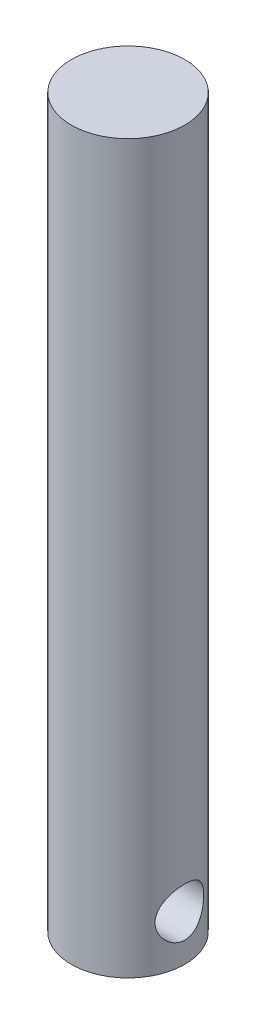
ISO-10303-21;
HEADER;
FILE_DESCRIPTION(('STEP AP214'),'2;1');
FILE_NAME('part.step','',(''),(''),'','','');
FILE_SCHEMA(('AUTOMOTIVE_DESIGN { 1 0 10303 214 1 1 1 1 }'));
ENDSEC;
DATA;
#1=APPLICATION_CONTEXT('core data for automotive mechanical design processes');
#2=APPLICATION_PROTOCOL_DEFINITION('international standard','automotive_design',2000,#1);
#3=PRODUCT_CONTEXT('',#1,'mechanical');
#4=PRODUCT('Part','Part','',(#3));
#5=PRODUCT_RELATED_PRODUCT_CATEGORY('part','',(#4));
#6=PRODUCT_DEFINITION_FORMATION('','',#4);
#7=PRODUCT_DEFINITION_CONTEXT('part definition',#1,'design');
#8=PRODUCT_DEFINITION('design','',#6,#7);
#9=PRODUCT_DEFINITION_SHAPE('','',#8);
#10=(LENGTH_UNIT() NAMED_UNIT(*) SI_UNIT(.MILLI.,.METRE.));
#11=(NAMED_UNIT(*) PLANE_ANGLE_UNIT() SI_UNIT($,.RADIAN.));
#12=(NAMED_UNIT(*) SI_UNIT($,.STERADIAN.) SOLID_ANGLE_UNIT());
#13=UNCERTAINTY_MEASURE_WITH_UNIT(LENGTH_MEASURE(1.E-05),#10,'distance_accuracy_value','');
#14=(GEOMETRIC_REPRESENTATION_CONTEXT(3) GLOBAL_UNCERTAINTY_ASSIGNED_CONTEXT((#13)) GLOBAL_UNIT_ASSIGNED_CONTEXT((#10,
#11,#12)) REPRESENTATION_CONTEXT('',''));
#15=CARTESIAN_POINT('',(0.,0.,0.));
#16=DIRECTION('',(0.,0.,1.));
#17=DIRECTION('',(1.,0.,0.));
#18=AXIS2_PLACEMENT_3D('',#15,#16,#17);
#19=CARTESIAN_POINT('',(0.,50.8,0.));
#20=DIRECTION('',(0.,-1.,0.));
#21=DIRECTION('',(0.,0.,1.));
#22=AXIS2_PLACEMENT_3D('',#19,#20,#21);
#23=CYLINDRICAL_SURFACE('',#22,3.96875);
#24=CARTESIAN_POINT('',(-3.58622037282987,3.175,1.7));
#25=CARTESIAN_POINT('',(-3.58623113706892,3.08459005344208,1.69998911546172));
#26=CARTESIAN_POINT('',(-3.58968938900767,2.99404356277239,1.69274199167995));
#27=CARTESIAN_POINT('',(-3.60307871804978,2.81557963908529,1.6640411575309));
#28=CARTESIAN_POINT('',(-3.61302690266575,2.72766979872845,1.64254989711271));
#29=CARTESIAN_POINT('',(-3.63804219046086,2.55739037711525,1.58636684632454));
#30=CARTESIAN_POINT('',(-3.65308759133628,2.47499905225026,1.55173094765683));
#31=CARTESIAN_POINT('',(-3.68657122753554,2.3172187711832,1.4704064892417));
#32=CARTESIAN_POINT('',(-3.70500879408357,2.24182843911496,1.42372030451515));
#33=CARTESIAN_POINT('',(-3.74455582562221,2.09518271102688,1.31633507475202));
#34=CARTESIAN_POINT('',(-3.76575910737061,2.02444335997849,1.25496554021632));
#35=CARTESIAN_POINT('',(-3.8076796275402,1.8938765569399,1.12136187333479));
#36=CARTESIAN_POINT('',(-3.8283966693971,1.83405345386459,1.04912343175391));
#37=CARTESIAN_POINT('',(-3.86816191973165,1.72433167004081,0.891728093718384));
#38=CARTESIAN_POINT('',(-3.88708845202858,1.67502072481835,0.80612793261505));
#39=CARTESIAN_POINT('',(-3.91998324015899,1.5917241528577,0.626889116143654));
#40=CARTESIAN_POINT('',(-3.93395381514694,1.55773135592966,0.53325424618402));
#41=CARTESIAN_POINT('',(-3.95469596900494,1.5079284067925,0.346028881740543));
#42=CARTESIAN_POINT('',(-3.96181911296762,1.49122644157612,0.252715371302695));
#43=CARTESIAN_POINT('',(-3.96934545838333,1.47359037231403,0.064356867094234));
#44=CARTESIAN_POINT('',(-3.96975155028843,1.47264948602845,-0.0306873642928482));
#45=CARTESIAN_POINT('',(-3.96399993382167,1.48611070884914,-0.213297108302966));
#46=CARTESIAN_POINT('',(-3.95826228294521,1.49953089186249,-0.300950773026008));
#47=CARTESIAN_POINT('',(-3.94145238730588,1.53964056824275,-0.472621705663843));
#48=CARTESIAN_POINT('',(-3.93037974833308,1.56633104217516,-0.556638704360109));
#49=CARTESIAN_POINT('',(-3.90374947102569,1.63253035483458,-0.720204048389507));
#50=CARTESIAN_POINT('',(-3.88812579368853,1.67222909698207,-0.799664337948033));
#51=CARTESIAN_POINT('',(-3.85390657578562,1.76312530568893,-0.951004404799201));
#52=CARTESIAN_POINT('',(-3.83530996854243,1.8143269021171,-1.02288144582381));
#53=CARTESIAN_POINT('',(-3.79537378132377,1.93116868168375,-1.16266167991575));
#54=CARTESIAN_POINT('',(-3.77393305560751,1.99759621203648,-1.22987875853107));
#55=CARTESIAN_POINT('',(-3.73173757559351,2.14080134495101,-1.35252605827245));
#56=CARTESIAN_POINT('',(-3.71098312002685,2.21758338282395,-1.40795120200164));
#57=CARTESIAN_POINT('',(-3.67176355740824,2.38283109399904,-1.50734671475435));
#58=CARTESIAN_POINT('',(-3.65340926120111,2.47162028600367,-1.55082677647832));
#59=CARTESIAN_POINT('',(-3.62240664524944,2.65625415543747,-1.62193371634608));
#60=CARTESIAN_POINT('',(-3.60975397811487,2.75209339224905,-1.64957267743231));
#61=CARTESIAN_POINT('',(-3.59268323727969,2.94121847824614,-1.68641381079726));
#62=CARTESIAN_POINT('',(-3.58776749724183,3.03424084026704,-1.69673336462996));
#63=CARTESIAN_POINT('',(-3.58530184937887,3.2207980552888,-1.70194025822124));
#64=CARTESIAN_POINT('',(-3.5877491419163,3.31433270000521,-1.69683346351972));
#65=CARTESIAN_POINT('',(-3.59921731420729,3.49241412668582,-1.67235374478536));
#66=CARTESIAN_POINT('',(-3.60777054658429,3.57713436986088,-1.653994735474));
#67=CARTESIAN_POINT('',(-3.62987674405693,3.74221182744115,-1.60489586590083));
#68=CARTESIAN_POINT('',(-3.64343092274405,3.82256797736696,-1.57415300025295));
#69=CARTESIAN_POINT('',(-3.6747268969317,3.98054569750963,-1.49968412721792));
#70=CARTESIAN_POINT('',(-3.69262508180863,4.05789666043565,-1.45545195142779));
#71=CARTESIAN_POINT('',(-3.73038151502514,4.20446332016495,-1.35575407279594));
#72=CARTESIAN_POINT('',(-3.7502406424614,4.27367533751209,-1.30028331983657));
#73=CARTESIAN_POINT('',(-3.79176455129882,4.40826919257133,-1.17400308940507));
#74=CARTESIAN_POINT('',(-3.81343616572478,4.47279446689132,-1.1022791902822));
#75=CARTESIAN_POINT('',(-3.85455404679553,4.58906239695361,-0.948533416909004));
#76=CARTESIAN_POINT('',(-3.87400009165408,4.64080377932815,-0.866510518030355));
#77=CARTESIAN_POINT('',(-3.90865457956745,4.73009137953567,-0.693679406401621));
#78=CARTESIAN_POINT('',(-3.92384194401562,4.7675673052295,-0.60283039006871));
#79=CARTESIAN_POINT('',(-3.94809086795851,4.82641480522334,-0.415295380859746));
#80=CARTESIAN_POINT('',(-3.95715630336448,4.84779657003157,-0.318613123443799));
#81=CARTESIAN_POINT('',(-3.96767127075444,4.8725130831658,-0.129788880179495));
#82=CARTESIAN_POINT('',(-3.96962935609121,4.87705346004854,-0.0378320493048763));
#83=CARTESIAN_POINT('',(-3.96714023501053,4.87124100800158,0.145510784931608));
#84=CARTESIAN_POINT('',(-3.96269426781214,4.86089106043125,0.236896895294529));
#85=CARTESIAN_POINT('',(-3.94817145617615,4.82645685339129,0.412811561785949));
#86=CARTESIAN_POINT('',(-3.93832136204818,4.80292490796238,0.497468546509107));
#87=CARTESIAN_POINT('',(-3.9140982764196,4.74341486237072,0.661587998364473));
#88=CARTESIAN_POINT('',(-3.8997244519767,4.70743446998762,0.741049505610523));
#89=CARTESIAN_POINT('',(-3.8670169985917,4.62222481149873,0.89652381189233));
#90=CARTESIAN_POINT('',(-3.84853264024002,4.57246602223183,0.97221391607124));
#91=CARTESIAN_POINT('',(-3.80976603642735,4.46186487546169,1.11449824350403));
#92=CARTESIAN_POINT('',(-3.78948308203129,4.4010181374709,1.18108885358492));
#93=CARTESIAN_POINT('',(-3.74754436850339,4.26477474597478,1.30831783828415));
#94=CARTESIAN_POINT('',(-3.72589576200376,4.18864279864083,1.368173975489));
#95=CARTESIAN_POINT('',(-3.68515605259579,4.02677477679791,1.47439832182803));
#96=CARTESIAN_POINT('',(-3.66606644026516,3.94103315771583,1.52075868812735));
#97=CARTESIAN_POINT('',(-3.63291840219493,3.76221239686101,1.59833196339931));
#98=CARTESIAN_POINT('',(-3.61885058446783,3.66914735395346,1.62957318823252));
#99=CARTESIAN_POINT('',(-3.59780126037644,3.47844788022475,1.67555044144813));
#100=CARTESIAN_POINT('',(-3.59079599179021,3.38082993573814,1.69034183337361));
#101=CARTESIAN_POINT('',(-3.58675667806582,3.24686351662433,1.69886499090494));
#102=CARTESIAN_POINT('',(-3.58621609349779,3.21094254848225,1.70000432715713));
#103=CARTESIAN_POINT('',(-3.58622037282987,3.175,1.7));
#104=B_SPLINE_CURVE_WITH_KNOTS('',3,(#24,#25,#26,#27,#28,#29,#30,#31,#32,#33,#34,#35,#36,#37,
#38,#39,#40,#41,#42,#43,#44,#45,#46,#47,#48,#49,#50,#51,#52,#53,#54,#55,#56,#57,#58,#59,#60,#61,
#62,#63,#64,#65,#66,#67,#68,#69,#70,#71,#72,#73,#74,#75,#76,#77,#78,#79,#80,#81,#82,#83,#84,#85,
#86,#87,#88,#89,#90,#91,#92,#93,#94,#95,#96,#97,#98,#99,#100,#101,#102,#103),.UNSPECIFIED.,.T.,
.F.,(4,2,2,2,2,2,2,2,2,2,2,2,2,2,2,2,2,2,2,2,2,2,2,2,2,2,2,2,2,2,2,2,2,2,2,2,2,2,2,4),(0.,
0.271122267186831,0.542962118356002,0.813658812563502,1.08430219517141,1.37111310872573,
1.65803803635866,1.95824745055016,2.25831619498843,2.5419933352771,2.82554840169842,
3.09088463268955,3.35624047276307,3.62565692960539,3.89517027003921,4.18459901178047,
4.474152125282,4.77424342805826,5.07410552781407,5.35375082399783,5.63328980440983,
5.89344279537735,6.15365895985511,6.42518379870137,6.69683092044961,6.99210230451842,
7.2874030878983,7.58414067105511,7.88069020735217,8.15554910363005,8.43035482035872,
8.69442547174946,8.95854477423391,9.23471297067145,9.51099050964756,9.80731026576914,
10.103801880814,10.3997360421804,10.6946711649093,10.8024560448255),.UNSPECIFIED.);
#105=CARTESIAN_POINT('',(-3.58622037282987,3.175,1.7));
#106=VERTEX_POINT('',#105);
#107=EDGE_CURVE('E48',#106,#106,#104,.T.);
#108=ORIENTED_EDGE('',*,*,#107,.T.);
#109=EDGE_LOOP('',(#108));
#110=FACE_BOUND('',#109,.T.);
#111=CARTESIAN_POINT('',(3.58622037282987,3.175,1.7));
#112=CARTESIAN_POINT('',(3.58623113706892,3.26540994655792,1.69998911546172));
#113=CARTESIAN_POINT('',(3.58968938900767,3.35595643722761,1.69274199167995));
#114=CARTESIAN_POINT('',(3.60307871804978,3.53442036091471,1.6640411575309));
#115=CARTESIAN_POINT('',(3.61302690266575,3.62233020127155,1.64254989711271));
#116=CARTESIAN_POINT('',(3.63804219046086,3.79260962288475,1.58636684632454));
#117=CARTESIAN_POINT('',(3.65308759133628,3.87500094774974,1.55173094765683));
#118=CARTESIAN_POINT('',(3.68657122753554,4.0327812288168,1.4704064892417));
#119=CARTESIAN_POINT('',(3.70500879408357,4.10817156088504,1.42372030451515));
#120=CARTESIAN_POINT('',(3.74455582562221,4.25481728897312,1.31633507475202));
#121=CARTESIAN_POINT('',(3.76575910737061,4.32555664002151,1.25496554021632));
#122=CARTESIAN_POINT('',(3.8076796275402,4.4561234430601,1.12136187333479));
#123=CARTESIAN_POINT('',(3.8283966693971,4.51594654613541,1.04912343175391));
#124=CARTESIAN_POINT('',(3.86816191973165,4.62566832995919,0.891728093718384));
#125=CARTESIAN_POINT('',(3.88708845202858,4.67497927518165,0.80612793261505));
#126=CARTESIAN_POINT('',(3.91998324015899,4.7582758471423,0.626889116143653));
#127=CARTESIAN_POINT('',(3.93395381514694,4.79226864407034,0.533254246184019));
#128=CARTESIAN_POINT('',(3.95469596900494,4.8420715932075,0.346028881740543));
#129=CARTESIAN_POINT('',(3.96181911296762,4.85877355842388,0.252715371302695));
#130=CARTESIAN_POINT('',(3.96934545838333,4.87640962768597,0.0643568670942337));
#131=CARTESIAN_POINT('',(3.96975155028843,4.87735051397155,-0.0306873642928486));
#132=CARTESIAN_POINT('',(3.96399993382167,4.86388929115086,-0.213297108302967));
#133=CARTESIAN_POINT('',(3.95826228294521,4.85046910813751,-0.300950773026008));
#134=CARTESIAN_POINT('',(3.94145238730588,4.81035943175725,-0.472621705663843));
#135=CARTESIAN_POINT('',(3.93037974833308,4.78366895782484,-0.556638704360109));
#136=CARTESIAN_POINT('',(3.90374947102569,4.71746964516542,-0.720204048389507));
#137=CARTESIAN_POINT('',(3.88812579368853,4.67777090301793,-0.799664337948034));
#138=CARTESIAN_POINT('',(3.85390657578562,4.58687469431107,-0.951004404799202));
#139=CARTESIAN_POINT('',(3.83530996854243,4.5356730978829,-1.02288144582381));
#140=CARTESIAN_POINT('',(3.79537378132377,4.41883131831625,-1.16266167991575));
#141=CARTESIAN_POINT('',(3.77393305560751,4.35240378796352,-1.22987875853107));
#142=CARTESIAN_POINT('',(3.73173757559351,4.20919865504899,-1.35252605827245));
#143=CARTESIAN_POINT('',(3.71098312002685,4.13241661717605,-1.40795120200164));
#144=CARTESIAN_POINT('',(3.67176355740824,3.96716890600096,-1.50734671475435));
#145=CARTESIAN_POINT('',(3.65340926120111,3.87837971399633,-1.55082677647832));
#146=CARTESIAN_POINT('',(3.62240664524944,3.69374584456253,-1.62193371634609));
#147=CARTESIAN_POINT('',(3.60975397811487,3.59790660775095,-1.64957267743231));
#148=CARTESIAN_POINT('',(3.59268323727969,3.40878152175386,-1.68641381079726));
#149=CARTESIAN_POINT('',(3.58776749724183,3.31575915973296,-1.69673336462996));
#150=CARTESIAN_POINT('',(3.58530184937887,3.1292019447112,-1.70194025822124));
#151=CARTESIAN_POINT('',(3.5877491419163,3.03566729999478,-1.69683346351972));
#152=CARTESIAN_POINT('',(3.59921731420729,2.85758587331418,-1.67235374478536));
#153=CARTESIAN_POINT('',(3.60777054658429,2.77286563013912,-1.653994735474));
#154=CARTESIAN_POINT('',(3.62987674405693,2.60778817255885,-1.60489586590083));
#155=CARTESIAN_POINT('',(3.64343092274405,2.52743202263304,-1.57415300025295));
#156=CARTESIAN_POINT('',(3.6747268969317,2.36945430249037,-1.49968412721792));
#157=CARTESIAN_POINT('',(3.69262508180863,2.29210333956435,-1.45545195142779));
#158=CARTESIAN_POINT('',(3.73038151502514,2.14553667983505,-1.35575407279594));
#159=CARTESIAN_POINT('',(3.7502406424614,2.07632466248791,-1.30028331983657));
#160=CARTESIAN_POINT('',(3.79176455129882,1.94173080742867,-1.17400308940507));
#161=CARTESIAN_POINT('',(3.81343616572478,1.87720553310868,-1.1022791902822));
#162=CARTESIAN_POINT('',(3.85455404679553,1.76093760304639,-0.948533416909004));
#163=CARTESIAN_POINT('',(3.87400009165408,1.70919622067185,-0.866510518030355));
#164=CARTESIAN_POINT('',(3.90865457956745,1.61990862046433,-0.693679406401621));
#165=CARTESIAN_POINT('',(3.92384194401562,1.5824326947705,-0.60283039006871));
#166=CARTESIAN_POINT('',(3.94809086795851,1.52358519477665,-0.415295380859746));
#167=CARTESIAN_POINT('',(3.95715630336448,1.50220342996843,-0.318613123443799));
#168=CARTESIAN_POINT('',(3.96767127075444,1.4774869168342,-0.129788880179494));
#169=CARTESIAN_POINT('',(3.96962935609121,1.47294653995146,-0.0378320493048759));
#170=CARTESIAN_POINT('',(3.96714023501053,1.47875899199842,0.145510784931608));
#171=CARTESIAN_POINT('',(3.96269426781214,1.48910893956875,0.23689689529453));
#172=CARTESIAN_POINT('',(3.94817145617615,1.52354314660871,0.412811561785949));
#173=CARTESIAN_POINT('',(3.93832136204818,1.54707509203762,0.497468546509107));
#174=CARTESIAN_POINT('',(3.9140982764196,1.60658513762928,0.661587998364473));
#175=CARTESIAN_POINT('',(3.8997244519767,1.64256553001238,0.741049505610523));
#176=CARTESIAN_POINT('',(3.8670169985917,1.72777518850127,0.89652381189233));
#177=CARTESIAN_POINT('',(3.84853264024002,1.77753397776817,0.972213916071241));
#178=CARTESIAN_POINT('',(3.80976603642735,1.88813512453831,1.11449824350403));
#179=CARTESIAN_POINT('',(3.78948308203129,1.9489818625291,1.18108885358492));
#180=CARTESIAN_POINT('',(3.74754436850339,2.08522525402522,1.30831783828415));
#181=CARTESIAN_POINT('',(3.72589576200376,2.16135720135917,1.368173975489));
#182=CARTESIAN_POINT('',(3.68515605259579,2.32322522320209,1.47439832182803));
#183=CARTESIAN_POINT('',(3.66606644026516,2.40896684228417,1.52075868812735));
#184=CARTESIAN_POINT('',(3.63291840219493,2.58778760313899,1.59833196339931));
#185=CARTESIAN_POINT('',(3.61885058446783,2.68085264604654,1.62957318823252));
#186=CARTESIAN_POINT('',(3.59780126037644,2.87155211977525,1.67555044144813));
#187=CARTESIAN_POINT('',(3.59079599179021,2.96917006426187,1.69034183337361));
#188=CARTESIAN_POINT('',(3.58675667806582,3.10313648337567,1.69886499090494));
#189=CARTESIAN_POINT('',(3.58621609349779,3.13905745151775,1.70000432715713));
#190=CARTESIAN_POINT('',(3.58622037282987,3.175,1.7));
#191=B_SPLINE_CURVE_WITH_KNOTS('',3,(#111,#112,#113,#114,#115,#116,#117,#118,#119,#120,#121,
#122,#123,#124,#125,#126,#127,#128,#129,#130,#131,#132,#133,#134,#135,#136,#137,#138,#139,#140,
#141,#142,#143,#144,#145,#146,#147,#148,#149,#150,#151,#152,#153,#154,#155,#156,#157,#158,#159,
#160,#161,#162,#163,#164,#165,#166,#167,#168,#169,#170,#171,#172,#173,#174,#175,#176,#177,#178,
#179,#180,#181,#182,#183,#184,#185,#186,#187,#188,#189,#190),.UNSPECIFIED.,.T.,.F.,(4,2,2,2,2,2,
2,2,2,2,2,2,2,2,2,2,2,2,2,2,2,2,2,2,2,2,2,2,2,2,2,2,2,2,2,2,2,2,2,4),(0.,0.271122267186831,
0.542962118356002,0.813658812563503,1.08430219517141,1.37111310872573,1.65803803635866,
1.95824745055017,2.25831619498843,2.5419933352771,2.82554840169842,3.09088463268955,
3.35624047276307,3.62565692960539,3.89517027003921,4.18459901178047,4.474152125282,
4.77424342805826,5.07410552781407,5.35375082399783,5.63328980440982,5.89344279537735,
6.15365895985511,6.42518379870137,6.69683092044961,6.99210230451842,7.2874030878983,
7.58414067105511,7.88069020735217,8.15554910363005,8.43035482035872,8.69442547174946,
8.95854477423391,9.23471297067144,9.51099050964756,9.80731026576914,10.1038018808139,
10.3997360421804,10.6946711649093,10.8024560448255),.UNSPECIFIED.);
#192=CARTESIAN_POINT('',(3.58622037282987,3.175,1.7));
#193=VERTEX_POINT('',#192);
#194=EDGE_CURVE('E57',#193,#193,#191,.T.);
#195=ORIENTED_EDGE('',*,*,#194,.T.);
#196=EDGE_LOOP('',(#195));
#197=FACE_BOUND('',#196,.T.);
#198=CARTESIAN_POINT('',(0.,50.8,0.));
#199=DIRECTION('',(0.,-1.,0.));
#200=DIRECTION('',(0.,0.,-1.));
#201=AXIS2_PLACEMENT_3D('',#198,#199,#200);
#202=CIRCLE('',#201,3.96875);
#203=CARTESIAN_POINT('',(0.,50.8,-3.96875));
#204=VERTEX_POINT('',#203);
#205=EDGE_CURVE('E10',#204,#204,#202,.T.);
#206=ORIENTED_EDGE('',*,*,#205,.T.);
#207=EDGE_LOOP('',(#206));
#208=FACE_BOUND('',#207,.T.);
#209=CARTESIAN_POINT('',(0.,0.,0.));
#210=DIRECTION('',(0.,-1.,0.));
#211=DIRECTION('',(0.,0.,-1.));
#212=AXIS2_PLACEMENT_3D('',#209,#210,#211);
#213=CIRCLE('',#212,3.96875);
#214=CARTESIAN_POINT('',(0.,0.,-3.96875));
#215=VERTEX_POINT('',#214);
#216=EDGE_CURVE('E41',#215,#215,#213,.T.);
#217=ORIENTED_EDGE('',*,*,#216,.F.);
#218=EDGE_LOOP('',(#217));
#219=FACE_BOUND('',#218,.T.);
#220=ADVANCED_FACE('F38',(#110,#197,#208,#219),#23,.T.);
#221=CARTESIAN_POINT('',(0.,50.8,0.));
#222=DIRECTION('',(0.,1.,0.));
#223=DIRECTION('',(0.,0.,-1.));
#224=AXIS2_PLACEMENT_3D('',#221,#222,#223);
#225=PLANE('',#224);
#226=ORIENTED_EDGE('',*,*,#205,.F.);
#227=EDGE_LOOP('',(#226));
#228=FACE_BOUND('',#227,.T.);
#229=ADVANCED_FACE('F68',(#228),#225,.T.);
#230=CARTESIAN_POINT('',(0.,0.,0.));
#231=DIRECTION('',(0.,1.,0.));
#232=DIRECTION('',(0.,0.,-1.));
#233=AXIS2_PLACEMENT_3D('',#230,#231,#232);
#234=PLANE('',#233);
#235=ORIENTED_EDGE('',*,*,#216,.T.);
#236=EDGE_LOOP('',(#235));
#237=FACE_BOUND('',#236,.T.);
#238=ADVANCED_FACE('F66',(#237),#234,.F.);
#239=CARTESIAN_POINT('',(-3.96975,3.175,0.));
#240=DIRECTION('',(1.,0.,0.));
#241=DIRECTION('',(0.,0.,1.));
#242=AXIS2_PLACEMENT_3D('',#239,#240,#241);
#243=CYLINDRICAL_SURFACE('',#242,1.7);
#244=ORIENTED_EDGE('',*,*,#194,.F.);
#245=EDGE_LOOP('',(#244));
#246=FACE_BOUND('',#245,.T.);
#247=ORIENTED_EDGE('',*,*,#107,.F.);
#248=EDGE_LOOP('',(#247));
#249=FACE_BOUND('',#248,.T.);
#250=ADVANCED_FACE('F62',(#246,#249),#243,.F.);
#251=CLOSED_SHELL('',(#220,#229,#238,#250));
#252=MANIFOLD_SOLID_BREP('B2',#251);
#253=ADVANCED_BREP_SHAPE_REPRESENTATION('',(#18,#252),#14);
#254=SHAPE_DEFINITION_REPRESENTATION(#9,#253);
ENDSEC;
END-ISO-10303-21;
